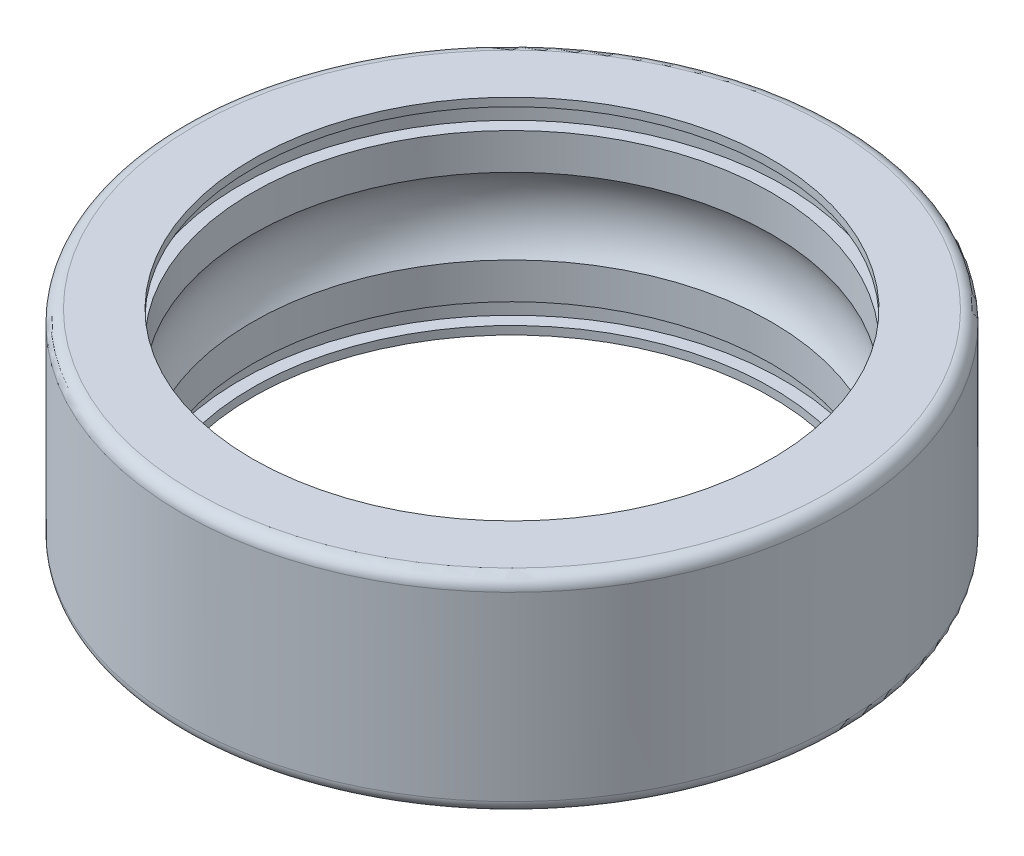
ISO-10303-21;
HEADER;
FILE_DESCRIPTION(('STEP AP214'),'2;1');
FILE_NAME('part.step','',(''),(''),'','','');
FILE_SCHEMA(('AUTOMOTIVE_DESIGN { 1 0 10303 214 1 1 1 1 }'));
ENDSEC;
DATA;
#1=APPLICATION_CONTEXT('core data for automotive mechanical design processes');
#2=APPLICATION_PROTOCOL_DEFINITION('international standard','automotive_design',2000,#1);
#3=PRODUCT_CONTEXT('',#1,'mechanical');
#4=PRODUCT('Part','Part','',(#3));
#5=PRODUCT_RELATED_PRODUCT_CATEGORY('part','',(#4));
#6=PRODUCT_DEFINITION_FORMATION('','',#4);
#7=PRODUCT_DEFINITION_CONTEXT('part definition',#1,'design');
#8=PRODUCT_DEFINITION('design','',#6,#7);
#9=PRODUCT_DEFINITION_SHAPE('','',#8);
#10=(LENGTH_UNIT() NAMED_UNIT(*) SI_UNIT(.MILLI.,.METRE.));
#11=(NAMED_UNIT(*) PLANE_ANGLE_UNIT() SI_UNIT($,.RADIAN.));
#12=(NAMED_UNIT(*) SI_UNIT($,.STERADIAN.) SOLID_ANGLE_UNIT());
#13=UNCERTAINTY_MEASURE_WITH_UNIT(LENGTH_MEASURE(1.E-05),#10,'distance_accuracy_value','');
#14=(GEOMETRIC_REPRESENTATION_CONTEXT(3) GLOBAL_UNCERTAINTY_ASSIGNED_CONTEXT((#13)) GLOBAL_UNIT_ASSIGNED_CONTEXT((#10,
#11,#12)) REPRESENTATION_CONTEXT('',''));
#15=CARTESIAN_POINT('',(0.,0.,0.));
#16=DIRECTION('',(0.,0.,1.));
#17=DIRECTION('',(1.,0.,0.));
#18=AXIS2_PLACEMENT_3D('',#15,#16,#17);
#19=CARTESIAN_POINT('',(0.,-2.75,0.));
#20=DIRECTION('',(0.,1.,0.));
#21=DIRECTION('',(0.,0.,-1.));
#22=AXIS2_PLACEMENT_3D('',#19,#20,#21);
#23=CYLINDRICAL_SURFACE('',#22,6.3);
#24=CARTESIAN_POINT('',(0.,-1.8,0.));
#25=DIRECTION('',(0.,1.,0.));
#26=DIRECTION('',(0.,0.,-1.));
#27=AXIS2_PLACEMENT_3D('',#24,#25,#26);
#28=CIRCLE('',#27,6.3);
#29=CARTESIAN_POINT('',(0.,-1.8,6.3));
#30=VERTEX_POINT('',#29);
#31=EDGE_CURVE('E11',#30,#30,#28,.T.);
#32=ORIENTED_EDGE('',*,*,#31,.F.);
#33=EDGE_LOOP('',(#32));
#34=FACE_BOUND('',#33,.T.);
#35=CARTESIAN_POINT('',(0.,-0.9217374897442,0.));
#36=DIRECTION('',(0.,1.,0.));
#37=DIRECTION('',(0.,0.,-1.));
#38=AXIS2_PLACEMENT_3D('',#35,#36,#37);
#39=CIRCLE('',#38,6.3);
#40=CARTESIAN_POINT('',(0.,-0.9217374897442,-6.3));
#41=VERTEX_POINT('',#40);
#42=EDGE_CURVE('E128',#41,#41,#39,.T.);
#43=ORIENTED_EDGE('',*,*,#42,.T.);
#44=EDGE_LOOP('',(#43));
#45=FACE_BOUND('',#44,.T.);
#46=ADVANCED_FACE('F17',(#34,#45),#23,.F.);
#47=CARTESIAN_POINT('',(0.,-1.8,0.));
#48=DIRECTION('',(0.,1.,0.));
#49=DIRECTION('',(1.,0.,0.));
#50=AXIS2_PLACEMENT_3D('',#47,#48,#49);
#51=PLANE('',#50);
#52=ORIENTED_EDGE('',*,*,#31,.T.);
#53=EDGE_LOOP('',(#52));
#54=FACE_BOUND('',#53,.T.);
#55=CARTESIAN_POINT('',(0.,-1.8,0.));
#56=DIRECTION('',(0.,-1.,0.));
#57=DIRECTION('',(0.,0.,-1.));
#58=AXIS2_PLACEMENT_3D('',#55,#56,#57);
#59=CIRCLE('',#58,6.605);
#60=CARTESIAN_POINT('',(0.,-1.8,6.605));
#61=VERTEX_POINT('',#60);
#62=EDGE_CURVE('E28',#61,#61,#59,.T.);
#63=ORIENTED_EDGE('',*,*,#62,.T.);
#64=EDGE_LOOP('',(#63));
#65=FACE_BOUND('',#64,.T.);
#66=ADVANCED_FACE('F137',(#54,#65),#51,.F.);
#67=CARTESIAN_POINT('',(0.,-2.75,0.));
#68=DIRECTION('',(0.,1.,0.));
#69=DIRECTION('',(0.,0.,-1.));
#70=AXIS2_PLACEMENT_3D('',#67,#68,#69);
#71=CYLINDRICAL_SURFACE('',#70,6.605);
#72=CARTESIAN_POINT('',(0.,-2.3,0.));
#73=DIRECTION('',(0.,1.,0.));
#74=DIRECTION('',(0.,0.,-1.));
#75=AXIS2_PLACEMENT_3D('',#72,#73,#74);
#76=CIRCLE('',#75,6.605);
#77=CARTESIAN_POINT('',(0.,-2.3,6.605));
#78=VERTEX_POINT('',#77);
#79=EDGE_CURVE('E92',#78,#78,#76,.T.);
#80=ORIENTED_EDGE('',*,*,#79,.F.);
#81=EDGE_LOOP('',(#80));
#82=FACE_BOUND('',#81,.T.);
#83=ORIENTED_EDGE('',*,*,#62,.F.);
#84=EDGE_LOOP('',(#83));
#85=FACE_BOUND('',#84,.T.);
#86=ADVANCED_FACE('F139',(#82,#85),#71,.F.);
#87=CARTESIAN_POINT('',(0.,-2.3,0.));
#88=DIRECTION('',(0.,1.,0.));
#89=DIRECTION('',(1.,0.,0.));
#90=AXIS2_PLACEMENT_3D('',#87,#88,#89);
#91=PLANE('',#90);
#92=CARTESIAN_POINT('',(0.,-2.3,0.));
#93=DIRECTION('',(0.,-1.,0.));
#94=DIRECTION('',(0.,0.,-1.));
#95=AXIS2_PLACEMENT_3D('',#92,#93,#94);
#96=CIRCLE('',#95,6.3);
#97=CARTESIAN_POINT('',(0.,-2.3,6.3));
#98=VERTEX_POINT('',#97);
#99=EDGE_CURVE('E86',#98,#98,#96,.T.);
#100=ORIENTED_EDGE('',*,*,#99,.T.);
#101=EDGE_LOOP('',(#100));
#102=FACE_BOUND('',#101,.T.);
#103=ORIENTED_EDGE('',*,*,#79,.T.);
#104=EDGE_LOOP('',(#103));
#105=FACE_BOUND('',#104,.T.);
#106=ADVANCED_FACE('F141',(#102,#105),#91,.T.);
#107=CARTESIAN_POINT('',(0.,-2.75,0.));
#108=DIRECTION('',(0.,1.,0.));
#109=DIRECTION('',(0.,0.,-1.));
#110=AXIS2_PLACEMENT_3D('',#107,#108,#109);
#111=CYLINDRICAL_SURFACE('',#110,6.3);
#112=CARTESIAN_POINT('',(0.,-2.5,0.));
#113=DIRECTION('',(0.,1.,0.));
#114=DIRECTION('',(0.,0.,-1.));
#115=AXIS2_PLACEMENT_3D('',#112,#113,#114);
#116=CIRCLE('',#115,6.3);
#117=CARTESIAN_POINT('',(0.,-2.5,6.3));
#118=VERTEX_POINT('',#117);
#119=EDGE_CURVE('E21',#118,#118,#116,.T.);
#120=ORIENTED_EDGE('',*,*,#119,.F.);
#121=EDGE_LOOP('',(#120));
#122=FACE_BOUND('',#121,.T.);
#123=ORIENTED_EDGE('',*,*,#99,.F.);
#124=EDGE_LOOP('',(#123));
#125=FACE_BOUND('',#124,.T.);
#126=ADVANCED_FACE('F149',(#122,#125),#111,.F.);
#127=CARTESIAN_POINT('',(0.,-2.5,0.));
#128=DIRECTION('',(0.,1.,0.));
#129=DIRECTION('',(1.,0.,0.));
#130=AXIS2_PLACEMENT_3D('',#127,#128,#129);
#131=PLANE('',#130);
#132=ORIENTED_EDGE('',*,*,#119,.T.);
#133=EDGE_LOOP('',(#132));
#134=FACE_BOUND('',#133,.T.);
#135=CARTESIAN_POINT('',(0.,-2.5,0.));
#136=DIRECTION('',(0.,-1.,0.));
#137=DIRECTION('',(0.,0.,-1.));
#138=AXIS2_PLACEMENT_3D('',#135,#136,#137);
#139=CIRCLE('',#138,7.7);
#140=CARTESIAN_POINT('',(0.,-2.5,7.7));
#141=VERTEX_POINT('',#140);
#142=EDGE_CURVE('E87',#141,#141,#139,.T.);
#143=ORIENTED_EDGE('',*,*,#142,.T.);
#144=EDGE_LOOP('',(#143));
#145=FACE_BOUND('',#144,.T.);
#146=ADVANCED_FACE('F82',(#134,#145),#131,.F.);
#147=CARTESIAN_POINT('',(0.,-2.2,0.));
#148=DIRECTION('',(0.,1.,0.));
#149=DIRECTION('',(0.,0.,-1.));
#150=AXIS2_PLACEMENT_3D('',#147,#148,#149);
#151=TOROIDAL_SURFACE('',#150,7.7,0.3);
#152=CARTESIAN_POINT('',(0.,-2.2,0.));
#153=DIRECTION('',(0.,-1.,0.));
#154=DIRECTION('',(0.,0.,-1.));
#155=AXIS2_PLACEMENT_3D('',#152,#153,#154);
#156=CIRCLE('',#155,8.);
#157=CARTESIAN_POINT('',(0.,-2.2,-8.));
#158=VERTEX_POINT('',#157);
#159=EDGE_CURVE('E95',#158,#158,#156,.T.);
#160=ORIENTED_EDGE('',*,*,#159,.T.);
#161=EDGE_LOOP('',(#160));
#162=FACE_BOUND('',#161,.T.);
#163=ORIENTED_EDGE('',*,*,#142,.F.);
#164=EDGE_LOOP('',(#163));
#165=FACE_BOUND('',#164,.T.);
#166=ADVANCED_FACE('F162',(#162,#165),#151,.T.);
#167=CARTESIAN_POINT('',(0.,-2.75,0.));
#168=DIRECTION('',(0.,1.,0.));
#169=DIRECTION('',(0.,0.,-1.));
#170=AXIS2_PLACEMENT_3D('',#167,#168,#169);
#171=CYLINDRICAL_SURFACE('',#170,8.);
#172=ORIENTED_EDGE('',*,*,#159,.F.);
#173=EDGE_LOOP('',(#172));
#174=FACE_BOUND('',#173,.T.);
#175=CARTESIAN_POINT('',(0.,2.2,0.));
#176=DIRECTION('',(0.,-1.,0.));
#177=DIRECTION('',(0.,0.,-1.));
#178=AXIS2_PLACEMENT_3D('',#175,#176,#177);
#179=CIRCLE('',#178,8.);
#180=CARTESIAN_POINT('',(0.,2.2,8.));
#181=VERTEX_POINT('',#180);
#182=EDGE_CURVE('E102',#181,#181,#179,.T.);
#183=ORIENTED_EDGE('',*,*,#182,.T.);
#184=EDGE_LOOP('',(#183));
#185=FACE_BOUND('',#184,.T.);
#186=ADVANCED_FACE('F164',(#174,#185),#171,.T.);
#187=CARTESIAN_POINT('',(0.,2.2,0.));
#188=DIRECTION('',(0.,1.,0.));
#189=DIRECTION('',(0.,0.,-1.));
#190=AXIS2_PLACEMENT_3D('',#187,#188,#189);
#191=TOROIDAL_SURFACE('',#190,7.7,0.3);
#192=CARTESIAN_POINT('',(0.,2.5,0.));
#193=DIRECTION('',(0.,1.,0.));
#194=DIRECTION('',(0.,0.,-1.));
#195=AXIS2_PLACEMENT_3D('',#192,#193,#194);
#196=CIRCLE('',#195,7.7);
#197=CARTESIAN_POINT('',(0.,2.5,7.7));
#198=VERTEX_POINT('',#197);
#199=EDGE_CURVE('E109',#198,#198,#196,.T.);
#200=ORIENTED_EDGE('',*,*,#199,.F.);
#201=EDGE_LOOP('',(#200));
#202=FACE_BOUND('',#201,.T.);
#203=ORIENTED_EDGE('',*,*,#182,.F.);
#204=EDGE_LOOP('',(#203));
#205=FACE_BOUND('',#204,.T.);
#206=ADVANCED_FACE('F170',(#202,#205),#191,.T.);
#207=CARTESIAN_POINT('',(0.,2.5,0.));
#208=DIRECTION('',(0.,1.,0.));
#209=DIRECTION('',(1.,0.,0.));
#210=AXIS2_PLACEMENT_3D('',#207,#208,#209);
#211=PLANE('',#210);
#212=CARTESIAN_POINT('',(0.,2.5,0.));
#213=DIRECTION('',(0.,-1.,0.));
#214=DIRECTION('',(0.,0.,-1.));
#215=AXIS2_PLACEMENT_3D('',#212,#213,#214);
#216=CIRCLE('',#215,6.3);
#217=CARTESIAN_POINT('',(0.,2.5,6.3));
#218=VERTEX_POINT('',#217);
#219=EDGE_CURVE('E106',#218,#218,#216,.T.);
#220=ORIENTED_EDGE('',*,*,#219,.T.);
#221=EDGE_LOOP('',(#220));
#222=FACE_BOUND('',#221,.T.);
#223=ORIENTED_EDGE('',*,*,#199,.T.);
#224=EDGE_LOOP('',(#223));
#225=FACE_BOUND('',#224,.T.);
#226=ADVANCED_FACE('F181',(#222,#225),#211,.T.);
#227=CARTESIAN_POINT('',(0.,-2.75,0.));
#228=DIRECTION('',(0.,1.,0.));
#229=DIRECTION('',(0.,0.,-1.));
#230=AXIS2_PLACEMENT_3D('',#227,#228,#229);
#231=CYLINDRICAL_SURFACE('',#230,6.3);
#232=CARTESIAN_POINT('',(0.,2.3,0.));
#233=DIRECTION('',(0.,1.,0.));
#234=DIRECTION('',(0.,0.,-1.));
#235=AXIS2_PLACEMENT_3D('',#232,#233,#234);
#236=CIRCLE('',#235,6.3);
#237=CARTESIAN_POINT('',(0.,2.3,6.3));
#238=VERTEX_POINT('',#237);
#239=EDGE_CURVE('E110',#238,#238,#236,.T.);
#240=ORIENTED_EDGE('',*,*,#239,.F.);
#241=EDGE_LOOP('',(#240));
#242=FACE_BOUND('',#241,.T.);
#243=ORIENTED_EDGE('',*,*,#219,.F.);
#244=EDGE_LOOP('',(#243));
#245=FACE_BOUND('',#244,.T.);
#246=ADVANCED_FACE('F187',(#242,#245),#231,.F.);
#247=CARTESIAN_POINT('',(0.,2.3,0.));
#248=DIRECTION('',(0.,1.,0.));
#249=DIRECTION('',(1.,0.,0.));
#250=AXIS2_PLACEMENT_3D('',#247,#248,#249);
#251=PLANE('',#250);
#252=ORIENTED_EDGE('',*,*,#239,.T.);
#253=EDGE_LOOP('',(#252));
#254=FACE_BOUND('',#253,.T.);
#255=CARTESIAN_POINT('',(0.,2.3,0.));
#256=DIRECTION('',(0.,-1.,0.));
#257=DIRECTION('',(0.,0.,-1.));
#258=AXIS2_PLACEMENT_3D('',#255,#256,#257);
#259=CIRCLE('',#258,6.605);
#260=CARTESIAN_POINT('',(0.,2.3,6.605));
#261=VERTEX_POINT('',#260);
#262=EDGE_CURVE('E116',#261,#261,#259,.T.);
#263=ORIENTED_EDGE('',*,*,#262,.T.);
#264=EDGE_LOOP('',(#263));
#265=FACE_BOUND('',#264,.T.);
#266=ADVANCED_FACE('F196',(#254,#265),#251,.F.);
#267=CARTESIAN_POINT('',(0.,-2.75,0.));
#268=DIRECTION('',(0.,1.,0.));
#269=DIRECTION('',(0.,0.,-1.));
#270=AXIS2_PLACEMENT_3D('',#267,#268,#269);
#271=CYLINDRICAL_SURFACE('',#270,6.605);
#272=CARTESIAN_POINT('',(0.,1.8,0.));
#273=DIRECTION('',(0.,1.,0.));
#274=DIRECTION('',(0.,0.,-1.));
#275=AXIS2_PLACEMENT_3D('',#272,#273,#274);
#276=CIRCLE('',#275,6.605);
#277=CARTESIAN_POINT('',(0.,1.8,6.605));
#278=VERTEX_POINT('',#277);
#279=EDGE_CURVE('E113',#278,#278,#276,.T.);
#280=ORIENTED_EDGE('',*,*,#279,.F.);
#281=EDGE_LOOP('',(#280));
#282=FACE_BOUND('',#281,.T.);
#283=ORIENTED_EDGE('',*,*,#262,.F.);
#284=EDGE_LOOP('',(#283));
#285=FACE_BOUND('',#284,.T.);
#286=ADVANCED_FACE('F192',(#282,#285),#271,.F.);
#287=CARTESIAN_POINT('',(0.,1.8,0.));
#288=DIRECTION('',(0.,1.,0.));
#289=DIRECTION('',(1.,0.,0.));
#290=AXIS2_PLACEMENT_3D('',#287,#288,#289);
#291=PLANE('',#290);
#292=CARTESIAN_POINT('',(0.,1.8,0.));
#293=DIRECTION('',(0.,-1.,0.));
#294=DIRECTION('',(0.,0.,-1.));
#295=AXIS2_PLACEMENT_3D('',#292,#293,#294);
#296=CIRCLE('',#295,6.3);
#297=CARTESIAN_POINT('',(0.,1.8,-6.3));
#298=VERTEX_POINT('',#297);
#299=EDGE_CURVE('E117',#298,#298,#296,.T.);
#300=ORIENTED_EDGE('',*,*,#299,.T.);
#301=EDGE_LOOP('',(#300));
#302=FACE_BOUND('',#301,.T.);
#303=ORIENTED_EDGE('',*,*,#279,.T.);
#304=EDGE_LOOP('',(#303));
#305=FACE_BOUND('',#304,.T.);
#306=ADVANCED_FACE('F195',(#302,#305),#291,.T.);
#307=CARTESIAN_POINT('',(0.,-2.75,0.));
#308=DIRECTION('',(0.,1.,0.));
#309=DIRECTION('',(0.,0.,-1.));
#310=AXIS2_PLACEMENT_3D('',#307,#308,#309);
#311=CYLINDRICAL_SURFACE('',#310,6.3);
#312=ORIENTED_EDGE('',*,*,#299,.F.);
#313=EDGE_LOOP('',(#312));
#314=FACE_BOUND('',#313,.T.);
#315=CARTESIAN_POINT('',(0.,0.9217374897442,0.));
#316=DIRECTION('',(0.,-1.,0.));
#317=DIRECTION('',(0.,0.,-1.));
#318=AXIS2_PLACEMENT_3D('',#315,#316,#317);
#319=CIRCLE('',#318,6.3);
#320=CARTESIAN_POINT('',(0.,0.9217374897442,6.3));
#321=VERTEX_POINT('',#320);
#322=EDGE_CURVE('E130',#321,#321,#319,.T.);
#323=ORIENTED_EDGE('',*,*,#322,.T.);
#324=EDGE_LOOP('',(#323));
#325=FACE_BOUND('',#324,.T.);
#326=ADVANCED_FACE('F19',(#314,#325),#311,.F.);
#327=CARTESIAN_POINT('',(0.,0.,0.));
#328=DIRECTION('',(0.,1.,0.));
#329=DIRECTION('',(0.,0.,-1.));
#330=AXIS2_PLACEMENT_3D('',#327,#328,#329);
#331=TOROIDAL_SURFACE('',#330,5.0075,1.5875);
#332=ORIENTED_EDGE('',*,*,#42,.F.);
#333=EDGE_LOOP('',(#332));
#334=FACE_BOUND('',#333,.T.);
#335=ORIENTED_EDGE('',*,*,#322,.F.);
#336=EDGE_LOOP('',(#335));
#337=FACE_BOUND('',#336,.T.);
#338=ADVANCED_FACE('F205',(#334,#337),#331,.F.);
#339=CLOSED_SHELL('',(#46,#66,#86,#106,#126,#146,#166,#186,#206,#226,#246,#266,#286,#306,#326,#338));
#340=MANIFOLD_SOLID_BREP('B1',#339);
#341=ADVANCED_BREP_SHAPE_REPRESENTATION('',(#18,#340),#14);
#342=SHAPE_DEFINITION_REPRESENTATION(#9,#341);
ENDSEC;
END-ISO-10303-21;
